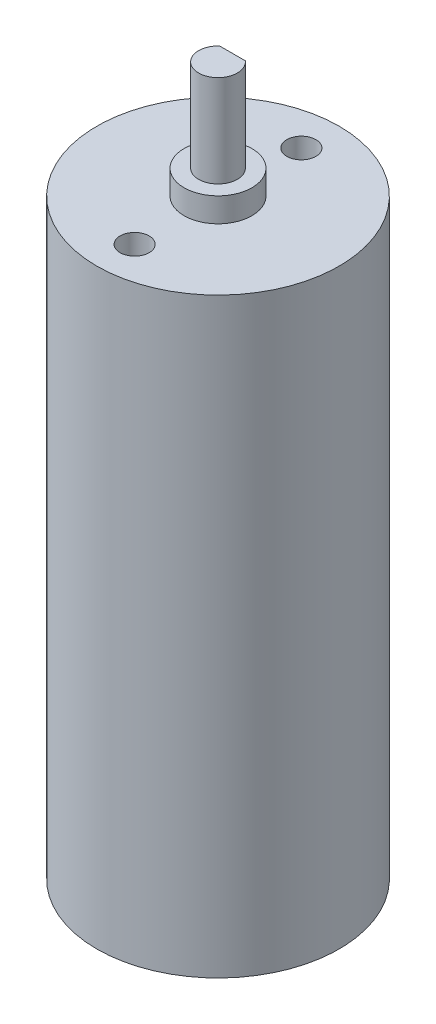
ISO-10303-21;
HEADER;
FILE_DESCRIPTION(('STEP AP214'),'2;1');
FILE_NAME('part.step','',(''),(''),'','','');
FILE_SCHEMA(('AUTOMOTIVE_DESIGN { 1 0 10303 214 1 1 1 1 }'));
ENDSEC;
DATA;
#1=APPLICATION_CONTEXT('core data for automotive mechanical design processes');
#2=APPLICATION_PROTOCOL_DEFINITION('international standard','automotive_design',2000,#1);
#3=PRODUCT_CONTEXT('',#1,'mechanical');
#4=PRODUCT('Part','Part','',(#3));
#5=PRODUCT_RELATED_PRODUCT_CATEGORY('part','',(#4));
#6=PRODUCT_DEFINITION_FORMATION('','',#4);
#7=PRODUCT_DEFINITION_CONTEXT('part definition',#1,'design');
#8=PRODUCT_DEFINITION('design','',#6,#7);
#9=PRODUCT_DEFINITION_SHAPE('','',#8);
#10=(LENGTH_UNIT() NAMED_UNIT(*) SI_UNIT(.MILLI.,.METRE.));
#11=(NAMED_UNIT(*) PLANE_ANGLE_UNIT() SI_UNIT($,.RADIAN.));
#12=(NAMED_UNIT(*) SI_UNIT($,.STERADIAN.) SOLID_ANGLE_UNIT());
#13=UNCERTAINTY_MEASURE_WITH_UNIT(LENGTH_MEASURE(1.E-05),#10,'distance_accuracy_value','');
#14=(GEOMETRIC_REPRESENTATION_CONTEXT(3) GLOBAL_UNCERTAINTY_ASSIGNED_CONTEXT((#13)) GLOBAL_UNIT_ASSIGNED_CONTEXT((#10,
#11,#12)) REPRESENTATION_CONTEXT('',''));
#15=CARTESIAN_POINT('',(0.,0.,0.));
#16=DIRECTION('',(0.,0.,1.));
#17=DIRECTION('',(1.,0.,0.));
#18=AXIS2_PLACEMENT_3D('',#15,#16,#17);
#19=CARTESIAN_POINT('',(0.,61.,0.));
#20=DIRECTION('',(0.,-1.,0.));
#21=DIRECTION('',(0.,0.,-1.));
#22=AXIS2_PLACEMENT_3D('',#19,#20,#21);
#23=CYLINDRICAL_SURFACE('',#22,12.5);
#24=CARTESIAN_POINT('',(0.,61.,0.));
#25=DIRECTION('',(0.,1.,0.));
#26=DIRECTION('',(0.,0.,1.));
#27=AXIS2_PLACEMENT_3D('',#24,#25,#26);
#28=CIRCLE('',#27,12.5);
#29=CARTESIAN_POINT('',(0.,61.,-12.5));
#30=VERTEX_POINT('',#29);
#31=EDGE_CURVE('E11',#30,#30,#28,.T.);
#32=CARTESIAN_POINT('',(0.,0.,0.));
#33=DIRECTION('',(0.,1.,0.));
#34=DIRECTION('',(0.,0.,1.));
#35=AXIS2_PLACEMENT_3D('',#32,#33,#34);
#36=CIRCLE('',#35,12.5);
#37=CARTESIAN_POINT('',(0.,0.,-12.5));
#38=VERTEX_POINT('',#37);
#39=EDGE_CURVE('E35',#38,#38,#36,.T.);
#40=CARTESIAN_POINT('',(0.,61.,-12.5));
#41=CARTESIAN_POINT('',(0.,60.3645833333333,-12.5));
#42=CARTESIAN_POINT('',(0.,59.7291666666667,-12.5));
#43=CARTESIAN_POINT('',(0.,58.4583333333333,-12.5));
#44=CARTESIAN_POINT('',(0.,57.8229166666667,-12.5));
#45=CARTESIAN_POINT('',(0.,56.5520833333333,-12.5));
#46=CARTESIAN_POINT('',(0.,55.9166666666667,-12.5));
#47=CARTESIAN_POINT('',(0.,54.6458333333333,-12.5));
#48=CARTESIAN_POINT('',(0.,54.0104166666667,-12.5));
#49=CARTESIAN_POINT('',(0.,52.7395833333333,-12.5));
#50=CARTESIAN_POINT('',(0.,52.1041666666667,-12.5));
#51=CARTESIAN_POINT('',(0.,50.8333333333333,-12.5));
#52=CARTESIAN_POINT('',(0.,50.1979166666667,-12.5));
#53=CARTESIAN_POINT('',(0.,48.9270833333333,-12.5));
#54=CARTESIAN_POINT('',(0.,48.2916666666667,-12.5));
#55=CARTESIAN_POINT('',(0.,47.0208333333333,-12.5));
#56=CARTESIAN_POINT('',(0.,46.3854166666667,-12.5));
#57=CARTESIAN_POINT('',(0.,45.1145833333333,-12.5));
#58=CARTESIAN_POINT('',(0.,44.4791666666667,-12.5));
#59=CARTESIAN_POINT('',(0.,43.2083333333333,-12.5));
#60=CARTESIAN_POINT('',(0.,42.5729166666667,-12.5));
#61=CARTESIAN_POINT('',(0.,41.3020833333333,-12.5));
#62=CARTESIAN_POINT('',(0.,40.6666666666667,-12.5));
#63=CARTESIAN_POINT('',(0.,39.3958333333333,-12.5));
#64=CARTESIAN_POINT('',(0.,38.7604166666667,-12.5));
#65=CARTESIAN_POINT('',(0.,37.4895833333333,-12.5));
#66=CARTESIAN_POINT('',(0.,36.8541666666667,-12.5));
#67=CARTESIAN_POINT('',(0.,35.5833333333333,-12.5));
#68=CARTESIAN_POINT('',(0.,34.9479166666667,-12.5));
#69=CARTESIAN_POINT('',(0.,33.6770833333333,-12.5));
#70=CARTESIAN_POINT('',(0.,33.0416666666667,-12.5));
#71=CARTESIAN_POINT('',(0.,31.7708333333333,-12.5));
#72=CARTESIAN_POINT('',(0.,31.1354166666667,-12.5));
#73=CARTESIAN_POINT('',(0.,29.8645833333333,-12.5));
#74=CARTESIAN_POINT('',(0.,29.2291666666667,-12.5));
#75=CARTESIAN_POINT('',(0.,27.9583333333333,-12.5));
#76=CARTESIAN_POINT('',(0.,27.3229166666667,-12.5));
#77=CARTESIAN_POINT('',(0.,26.0520833333333,-12.5));
#78=CARTESIAN_POINT('',(0.,25.4166666666667,-12.5));
#79=CARTESIAN_POINT('',(0.,24.1458333333333,-12.5));
#80=CARTESIAN_POINT('',(0.,23.5104166666667,-12.5));
#81=CARTESIAN_POINT('',(0.,22.2395833333333,-12.5));
#82=CARTESIAN_POINT('',(0.,21.6041666666667,-12.5));
#83=CARTESIAN_POINT('',(0.,20.3333333333333,-12.5));
#84=CARTESIAN_POINT('',(0.,19.6979166666667,-12.5));
#85=CARTESIAN_POINT('',(0.,18.4270833333333,-12.5));
#86=CARTESIAN_POINT('',(0.,17.7916666666667,-12.5));
#87=CARTESIAN_POINT('',(0.,16.5208333333333,-12.5));
#88=CARTESIAN_POINT('',(0.,15.8854166666667,-12.5));
#89=CARTESIAN_POINT('',(0.,14.6145833333333,-12.5));
#90=CARTESIAN_POINT('',(0.,13.9791666666667,-12.5));
#91=CARTESIAN_POINT('',(0.,12.7083333333333,-12.5));
#92=CARTESIAN_POINT('',(0.,12.0729166666667,-12.5));
#93=CARTESIAN_POINT('',(0.,10.8020833333333,-12.5));
#94=CARTESIAN_POINT('',(0.,10.1666666666667,-12.5));
#95=CARTESIAN_POINT('',(0.,8.89583333333333,-12.5));
#96=CARTESIAN_POINT('',(0.,8.26041666666666,-12.5));
#97=CARTESIAN_POINT('',(0.,6.98958333333333,-12.5));
#98=CARTESIAN_POINT('',(0.,6.35416666666666,-12.5));
#99=CARTESIAN_POINT('',(0.,5.08333333333333,-12.5));
#100=CARTESIAN_POINT('',(0.,4.44791666666666,-12.5));
#101=CARTESIAN_POINT('',(0.,3.17708333333333,-12.5));
#102=CARTESIAN_POINT('',(0.,2.54166666666666,-12.5));
#103=CARTESIAN_POINT('',(0.,1.27083333333332,-12.5));
#104=CARTESIAN_POINT('',(0.,0.635416666666658,-12.5));
#105=CARTESIAN_POINT('',(0.,0.,-12.5));
#106=B_SPLINE_CURVE_WITH_KNOTS('',3,(#40,#41,#42,#43,#44,#45,#46,#47,#48,#49,#50,#51,#52,#53,
#54,#55,#56,#57,#58,#59,#60,#61,#62,#63,#64,#65,#66,#67,#68,#69,#70,#71,#72,#73,#74,#75,#76,#77,
#78,#79,#80,#81,#82,#83,#84,#85,#86,#87,#88,#89,#90,#91,#92,#93,#94,#95,#96,#97,#98,#99,#100,
#101,#102,#103,#104,#105),.UNSPECIFIED.,.F.,.F.,(4,2,2,2,2,2,2,2,2,2,2,2,2,2,2,2,2,2,2,2,2,2,2,
2,2,2,2,2,2,2,2,2,4),(0.,1.90625000000001,3.8125,5.71875,7.62500000000001,9.53125000000001,
11.4375,13.34375,15.25,17.15625,19.0625,20.96875,22.875,24.78125,26.6875,28.59375,30.5,32.40625,
34.3125,36.21875,38.125,40.03125,41.9375,43.84375,45.75,47.65625,49.5625,51.46875,53.375,
55.28125,57.1875,59.09375,61.),.UNSPECIFIED.);
#107=EDGE_CURVE('BSEAM32',#30,#38,#106,.T.);
#108=ORIENTED_EDGE('',*,*,#31,.F.);
#109=ORIENTED_EDGE('',*,*,#39,.T.);
#110=ORIENTED_EDGE('',*,*,#107,.T.);
#111=ORIENTED_EDGE('',*,*,#107,.F.);
#112=EDGE_LOOP('',(#108,#110,#109,#111));
#113=FACE_BOUND('',#112,.T.);
#114=ADVANCED_FACE('F32',(#113),#23,.T.);
#115=CARTESIAN_POINT('',(0.,61.,0.));
#116=DIRECTION('',(0.,1.,0.));
#117=DIRECTION('',(0.,0.,1.));
#118=AXIS2_PLACEMENT_3D('',#115,#116,#117);
#119=PLANE('',#118);
#120=CARTESIAN_POINT('',(0.,61.,8.6));
#121=DIRECTION('',(0.,1.,0.));
#122=DIRECTION('',(0.,0.,1.));
#123=AXIS2_PLACEMENT_3D('',#120,#121,#122);
#124=CIRCLE('',#123,1.5);
#125=CARTESIAN_POINT('',(0.,61.,10.1));
#126=VERTEX_POINT('',#125);
#127=EDGE_CURVE('E144',#126,#126,#124,.T.);
#128=ORIENTED_EDGE('',*,*,#127,.F.);
#129=EDGE_LOOP('',(#128));
#130=FACE_BOUND('',#129,.T.);
#131=CARTESIAN_POINT('',(0.,61.,-8.6));
#132=DIRECTION('',(0.,1.,0.));
#133=DIRECTION('',(0.,0.,1.));
#134=AXIS2_PLACEMENT_3D('',#131,#132,#133);
#135=CIRCLE('',#134,1.5);
#136=CARTESIAN_POINT('',(0.,61.,-7.1));
#137=VERTEX_POINT('',#136);
#138=EDGE_CURVE('E143',#137,#137,#135,.T.);
#139=ORIENTED_EDGE('',*,*,#138,.F.);
#140=EDGE_LOOP('',(#139));
#141=FACE_BOUND('',#140,.T.);
#142=CARTESIAN_POINT('',(0.,61.,0.));
#143=DIRECTION('',(0.,1.,0.));
#144=DIRECTION('',(0.,0.,1.));
#145=AXIS2_PLACEMENT_3D('',#142,#143,#144);
#146=CIRCLE('',#145,3.5);
#147=CARTESIAN_POINT('',(0.,61.,3.5));
#148=VERTEX_POINT('',#147);
#149=EDGE_CURVE('E63',#148,#148,#146,.T.);
#150=ORIENTED_EDGE('',*,*,#149,.F.);
#151=EDGE_LOOP('',(#150));
#152=FACE_BOUND('',#151,.T.);
#153=ORIENTED_EDGE('',*,*,#31,.T.);
#154=EDGE_LOOP('',(#153));
#155=FACE_BOUND('',#154,.T.);
#156=ADVANCED_FACE('F90',(#130,#141,#152,#155),#119,.T.);
#157=CARTESIAN_POINT('',(0.,0.,0.));
#158=DIRECTION('',(0.,1.,0.));
#159=DIRECTION('',(0.,0.,1.));
#160=AXIS2_PLACEMENT_3D('',#157,#158,#159);
#161=PLANE('',#160);
#162=ORIENTED_EDGE('',*,*,#39,.F.);
#163=EDGE_LOOP('',(#162));
#164=FACE_BOUND('',#163,.T.);
#165=ADVANCED_FACE('F93',(#164),#161,.F.);
#166=CARTESIAN_POINT('',(0.,63.5,0.));
#167=DIRECTION('',(0.,-1.,0.));
#168=DIRECTION('',(0.,0.,-1.));
#169=AXIS2_PLACEMENT_3D('',#166,#167,#168);
#170=CYLINDRICAL_SURFACE('',#169,3.5);
#171=CARTESIAN_POINT('',(0.,63.5,0.));
#172=DIRECTION('',(0.,1.,0.));
#173=DIRECTION('',(0.,0.,1.));
#174=AXIS2_PLACEMENT_3D('',#171,#172,#173);
#175=CIRCLE('',#174,3.5);
#176=CARTESIAN_POINT('',(0.,63.5,3.5));
#177=VERTEX_POINT('',#176);
#178=EDGE_CURVE('E82',#177,#177,#175,.T.);
#179=ORIENTED_EDGE('',*,*,#178,.F.);
#180=EDGE_LOOP('',(#179));
#181=FACE_BOUND('',#180,.T.);
#182=ORIENTED_EDGE('',*,*,#149,.T.);
#183=EDGE_LOOP('',(#182));
#184=FACE_BOUND('',#183,.T.);
#185=ADVANCED_FACE('F88',(#181,#184),#170,.T.);
#186=CARTESIAN_POINT('',(0.,63.5,0.));
#187=DIRECTION('',(0.,1.,0.));
#188=DIRECTION('',(0.,0.,1.));
#189=AXIS2_PLACEMENT_3D('',#186,#187,#188);
#190=PLANE('',#189);
#191=CARTESIAN_POINT('',(0.,63.5,0.));
#192=DIRECTION('',(0.,1.,0.));
#193=DIRECTION('',(0.,0.,1.));
#194=AXIS2_PLACEMENT_3D('',#191,#192,#193);
#195=CIRCLE('',#194,2.);
#196=CARTESIAN_POINT('',(0.,63.5,2.));
#197=VERTEX_POINT('',#196);
#198=EDGE_CURVE('E64',#197,#197,#195,.T.);
#199=ORIENTED_EDGE('',*,*,#198,.F.);
#200=EDGE_LOOP('',(#199));
#201=FACE_BOUND('',#200,.T.);
#202=ORIENTED_EDGE('',*,*,#178,.T.);
#203=EDGE_LOOP('',(#202));
#204=FACE_BOUND('',#203,.T.);
#205=ADVANCED_FACE('F107',(#201,#204),#190,.T.);
#206=CARTESIAN_POINT('',(0.,65.,0.));
#207=DIRECTION('',(0.,-1.,0.));
#208=DIRECTION('',(0.,0.,-1.));
#209=AXIS2_PLACEMENT_3D('',#206,#207,#208);
#210=CYLINDRICAL_SURFACE('',#209,2.);
#211=CARTESIAN_POINT('',(0.,65.,0.));
#212=DIRECTION('',(0.,1.,0.));
#213=DIRECTION('',(0.,0.,1.));
#214=AXIS2_PLACEMENT_3D('',#211,#212,#213);
#215=CIRCLE('',#214,2.);
#216=CARTESIAN_POINT('',(1.3228756555323,65.,-1.5));
#217=VERTEX_POINT('',#216);
#218=CARTESIAN_POINT('',(-1.3228756555323,65.,-1.5));
#219=VERTEX_POINT('',#218);
#220=EDGE_CURVE('E57',#217,#219,#215,.T.);
#221=ORIENTED_EDGE('',*,*,#220,.F.);
#222=DIRECTION('',(0.,-1.,0.));
#223=VECTOR('',#222,1.);
#224=CARTESIAN_POINT('',(1.3228756555323,73.,-1.5));
#225=LINE('',#224,#223);
#226=CARTESIAN_POINT('',(1.3228756555323,73.,-1.5));
#227=VERTEX_POINT('',#226);
#228=EDGE_CURVE('E70',#227,#217,#225,.T.);
#229=ORIENTED_EDGE('',*,*,#228,.F.);
#230=CARTESIAN_POINT('',(0.,73.,0.));
#231=DIRECTION('',(0.,1.,0.));
#232=DIRECTION('',(0.,0.,1.));
#233=AXIS2_PLACEMENT_3D('',#230,#231,#232);
#234=CIRCLE('',#233,2.);
#235=CARTESIAN_POINT('',(-1.3228756555323,73.,-1.5));
#236=VERTEX_POINT('',#235);
#237=EDGE_CURVE('E71',#236,#227,#234,.T.);
#238=ORIENTED_EDGE('',*,*,#237,.F.);
#239=DIRECTION('',(0.,-1.,0.));
#240=VECTOR('',#239,1.);
#241=CARTESIAN_POINT('',(-1.3228756555323,73.,-1.5));
#242=LINE('',#241,#240);
#243=EDGE_CURVE('E68',#236,#219,#242,.T.);
#244=ORIENTED_EDGE('',*,*,#243,.T.);
#245=EDGE_LOOP('',(#221,#229,#238,#244));
#246=FACE_BOUND('',#245,.T.);
#247=ORIENTED_EDGE('',*,*,#198,.T.);
#248=EDGE_LOOP('',(#247));
#249=FACE_BOUND('',#248,.T.);
#250=ADVANCED_FACE('F74',(#246,#249),#210,.T.);
#251=CARTESIAN_POINT('',(0.,65.,0.));
#252=DIRECTION('',(0.,1.,0.));
#253=DIRECTION('',(0.,0.,1.));
#254=AXIS2_PLACEMENT_3D('',#251,#252,#253);
#255=PLANE('',#254);
#256=DIRECTION('',(-1.,0.,0.));
#257=VECTOR('',#256,1.);
#258=CARTESIAN_POINT('',(-1.3228756555323,65.,-1.5));
#259=LINE('',#258,#257);
#260=EDGE_CURVE('E45',#217,#219,#259,.T.);
#261=ORIENTED_EDGE('',*,*,#260,.F.);
#262=ORIENTED_EDGE('',*,*,#220,.T.);
#263=EDGE_LOOP('',(#261,#262));
#264=FACE_BOUND('',#263,.T.);
#265=ADVANCED_FACE('F58',(#264),#255,.T.);
#266=CARTESIAN_POINT('',(-1.3228756555323,73.,-1.5));
#267=DIRECTION('',(0.,0.,1.));
#268=DIRECTION('',(1.,0.,0.));
#269=AXIS2_PLACEMENT_3D('',#266,#267,#268);
#270=PLANE('',#269);
#271=ORIENTED_EDGE('',*,*,#260,.T.);
#272=ORIENTED_EDGE('',*,*,#243,.F.);
#273=DIRECTION('',(-1.,0.,0.));
#274=VECTOR('',#273,1.);
#275=CARTESIAN_POINT('',(-1.3228756555323,73.,-1.5));
#276=LINE('',#275,#274);
#277=EDGE_CURVE('E53',#227,#236,#276,.T.);
#278=ORIENTED_EDGE('',*,*,#277,.F.);
#279=ORIENTED_EDGE('',*,*,#228,.T.);
#280=EDGE_LOOP('',(#271,#272,#278,#279));
#281=FACE_BOUND('',#280,.T.);
#282=ADVANCED_FACE('F67',(#281),#270,.F.);
#283=CARTESIAN_POINT('',(0.,73.,0.));
#284=DIRECTION('',(0.,1.,0.));
#285=DIRECTION('',(0.,0.,1.));
#286=AXIS2_PLACEMENT_3D('',#283,#284,#285);
#287=PLANE('',#286);
#288=ORIENTED_EDGE('',*,*,#237,.T.);
#289=ORIENTED_EDGE('',*,*,#277,.T.);
#290=EDGE_LOOP('',(#288,#289));
#291=FACE_BOUND('',#290,.T.);
#292=ADVANCED_FACE('F120',(#291),#287,.T.);
#293=CARTESIAN_POINT('',(0.,58.,-8.6));
#294=DIRECTION('',(0.,1.,0.));
#295=DIRECTION('',(0.,0.,1.));
#296=AXIS2_PLACEMENT_3D('',#293,#294,#295);
#297=CYLINDRICAL_SURFACE('',#296,1.5);
#298=CARTESIAN_POINT('',(0.,58.,-8.6));
#299=DIRECTION('',(0.,1.,0.));
#300=DIRECTION('',(0.,0.,1.));
#301=AXIS2_PLACEMENT_3D('',#298,#299,#300);
#302=CIRCLE('',#301,1.5);
#303=CARTESIAN_POINT('',(0.,58.,-7.1));
#304=VERTEX_POINT('',#303);
#305=EDGE_CURVE('E72',#304,#304,#302,.T.);
#306=ORIENTED_EDGE('',*,*,#305,.F.);
#307=EDGE_LOOP('',(#306));
#308=FACE_BOUND('',#307,.T.);
#309=ORIENTED_EDGE('',*,*,#138,.T.);
#310=EDGE_LOOP('',(#309));
#311=FACE_BOUND('',#310,.T.);
#312=ADVANCED_FACE('F123',(#308,#311),#297,.F.);
#313=CARTESIAN_POINT('',(0.,58.,-8.6));
#314=DIRECTION('',(0.,1.,0.));
#315=DIRECTION('',(0.,0.,1.));
#316=AXIS2_PLACEMENT_3D('',#313,#314,#315);
#317=PLANE('',#316);
#318=ORIENTED_EDGE('',*,*,#305,.T.);
#319=EDGE_LOOP('',(#318));
#320=FACE_BOUND('',#319,.T.);
#321=ADVANCED_FACE('F126',(#320),#317,.T.);
#322=CARTESIAN_POINT('',(0.,58.,8.6));
#323=DIRECTION('',(0.,1.,0.));
#324=DIRECTION('',(0.,0.,1.));
#325=AXIS2_PLACEMENT_3D('',#322,#323,#324);
#326=CYLINDRICAL_SURFACE('',#325,1.5);
#327=CARTESIAN_POINT('',(0.,58.,8.6));
#328=DIRECTION('',(0.,1.,0.));
#329=DIRECTION('',(0.,0.,1.));
#330=AXIS2_PLACEMENT_3D('',#327,#328,#329);
#331=CIRCLE('',#330,1.5);
#332=CARTESIAN_POINT('',(0.,58.,10.1));
#333=VERTEX_POINT('',#332);
#334=EDGE_CURVE('E142',#333,#333,#331,.T.);
#335=ORIENTED_EDGE('',*,*,#334,.F.);
#336=EDGE_LOOP('',(#335));
#337=FACE_BOUND('',#336,.T.);
#338=ORIENTED_EDGE('',*,*,#127,.T.);
#339=EDGE_LOOP('',(#338));
#340=FACE_BOUND('',#339,.T.);
#341=ADVANCED_FACE('F130',(#337,#340),#326,.F.);
#342=CARTESIAN_POINT('',(0.,58.,8.6));
#343=DIRECTION('',(0.,1.,0.));
#344=DIRECTION('',(0.,0.,1.));
#345=AXIS2_PLACEMENT_3D('',#342,#343,#344);
#346=PLANE('',#345);
#347=ORIENTED_EDGE('',*,*,#334,.T.);
#348=EDGE_LOOP('',(#347));
#349=FACE_BOUND('',#348,.T.);
#350=ADVANCED_FACE('F134',(#349),#346,.T.);
#351=CLOSED_SHELL('',(#114,#156,#165,#185,#205,#250,#265,#282,#292,#312,#321,#341,#350));
#352=MANIFOLD_SOLID_BREP('B2',#351);
#353=ADVANCED_BREP_SHAPE_REPRESENTATION('',(#18,#352),#14);
#354=SHAPE_DEFINITION_REPRESENTATION(#9,#353);
ENDSEC;
END-ISO-10303-21;
